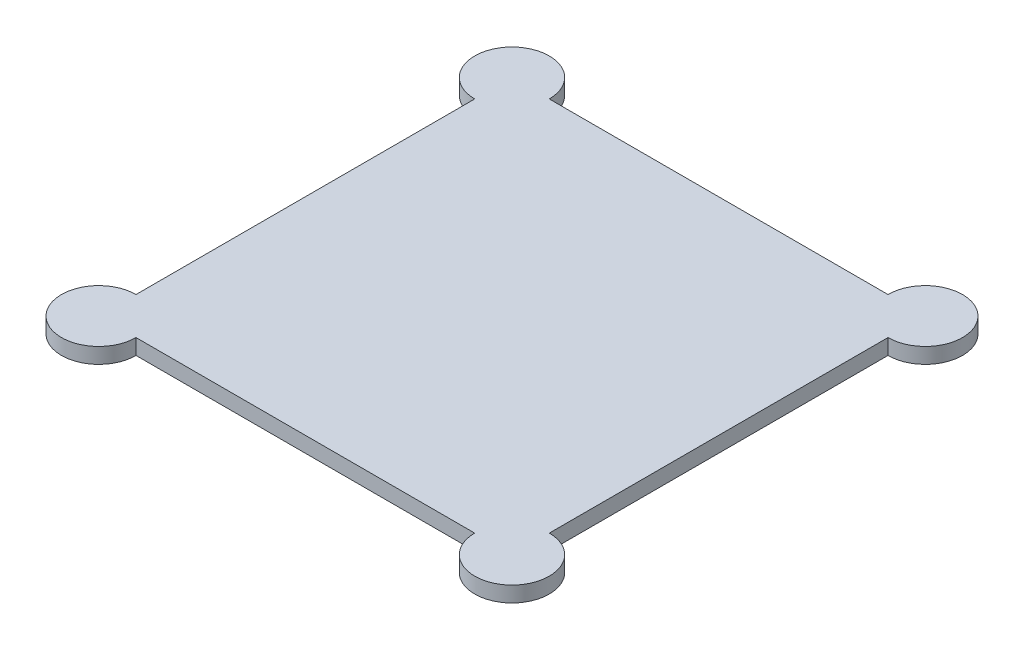
ISO-10303-21;
HEADER;
FILE_DESCRIPTION(('STEP AP214'),'2;1');
FILE_NAME('part.step','',(''),(''),'','','');
FILE_SCHEMA(('AUTOMOTIVE_DESIGN { 1 0 10303 214 1 1 1 1 }'));
ENDSEC;
DATA;
#1=APPLICATION_CONTEXT('core data for automotive mechanical design processes');
#2=APPLICATION_PROTOCOL_DEFINITION('international standard','automotive_design',2000,#1);
#3=PRODUCT_CONTEXT('',#1,'mechanical');
#4=PRODUCT('Part','Part','',(#3));
#5=PRODUCT_RELATED_PRODUCT_CATEGORY('part','',(#4));
#6=PRODUCT_DEFINITION_FORMATION('','',#4);
#7=PRODUCT_DEFINITION_CONTEXT('part definition',#1,'design');
#8=PRODUCT_DEFINITION('design','',#6,#7);
#9=PRODUCT_DEFINITION_SHAPE('','',#8);
#10=(LENGTH_UNIT() NAMED_UNIT(*) SI_UNIT(.MILLI.,.METRE.));
#11=(NAMED_UNIT(*) PLANE_ANGLE_UNIT() SI_UNIT($,.RADIAN.));
#12=(NAMED_UNIT(*) SI_UNIT($,.STERADIAN.) SOLID_ANGLE_UNIT());
#13=UNCERTAINTY_MEASURE_WITH_UNIT(LENGTH_MEASURE(1.E-05),#10,'distance_accuracy_value','');
#14=(GEOMETRIC_REPRESENTATION_CONTEXT(3) GLOBAL_UNCERTAINTY_ASSIGNED_CONTEXT((#13)) GLOBAL_UNIT_ASSIGNED_CONTEXT((#10,
#11,#12)) REPRESENTATION_CONTEXT('',''));
#15=CARTESIAN_POINT('',(0.,0.,0.));
#16=DIRECTION('',(0.,0.,1.));
#17=DIRECTION('',(1.,0.,0.));
#18=AXIS2_PLACEMENT_3D('',#15,#16,#17);
#19=CARTESIAN_POINT('',(-133.,10.,133.));
#20=DIRECTION('',(0.,-1.,0.));
#21=DIRECTION('',(0.,0.,-1.));
#22=AXIS2_PLACEMENT_3D('',#19,#20,#21);
#23=CYLINDRICAL_SURFACE('',#22,24.);
#24=CARTESIAN_POINT('',(-133.,0.,133.));
#25=DIRECTION('',(0.,1.,0.));
#26=DIRECTION('',(0.,0.,1.));
#27=AXIS2_PLACEMENT_3D('',#24,#25,#26);
#28=CIRCLE('',#27,24.);
#29=CARTESIAN_POINT('',(-133.,0.,109.));
#30=VERTEX_POINT('',#29);
#31=CARTESIAN_POINT('',(-109.,0.,133.));
#32=VERTEX_POINT('',#31);
#33=EDGE_CURVE('E135',#30,#32,#28,.T.);
#34=ORIENTED_EDGE('',*,*,#33,.T.);
#35=DIRECTION('',(0.,-1.,0.));
#36=VECTOR('',#35,1.);
#37=CARTESIAN_POINT('',(-109.,10.,133.));
#38=LINE('',#37,#36);
#39=CARTESIAN_POINT('',(-109.,10.,133.));
#40=VERTEX_POINT('',#39);
#41=EDGE_CURVE('E11',#40,#32,#38,.T.);
#42=ORIENTED_EDGE('',*,*,#41,.F.);
#43=CARTESIAN_POINT('',(-133.,10.,133.));
#44=DIRECTION('',(0.,1.,0.));
#45=DIRECTION('',(0.,0.,1.));
#46=AXIS2_PLACEMENT_3D('',#43,#44,#45);
#47=CIRCLE('',#46,24.);
#48=CARTESIAN_POINT('',(-133.,10.,109.));
#49=VERTEX_POINT('',#48);
#50=EDGE_CURVE('E152',#49,#40,#47,.T.);
#51=ORIENTED_EDGE('',*,*,#50,.F.);
#52=DIRECTION('',(0.,-1.,0.));
#53=VECTOR('',#52,1.);
#54=CARTESIAN_POINT('',(-133.,10.,109.));
#55=LINE('',#54,#53);
#56=EDGE_CURVE('E134',#49,#30,#55,.T.);
#57=ORIENTED_EDGE('',*,*,#56,.T.);
#58=EDGE_LOOP('',(#34,#42,#51,#57));
#59=FACE_BOUND('',#58,.T.);
#60=ADVANCED_FACE('F37',(#59),#23,.T.);
#61=CARTESIAN_POINT('',(0.,10.,133.));
#62=DIRECTION('',(0.,0.,-1.));
#63=DIRECTION('',(-1.,0.,0.));
#64=AXIS2_PLACEMENT_3D('',#61,#62,#63);
#65=PLANE('',#64);
#66=DIRECTION('',(1.,0.,0.));
#67=VECTOR('',#66,1.);
#68=CARTESIAN_POINT('',(0.,0.,133.));
#69=LINE('',#68,#67);
#70=CARTESIAN_POINT('',(109.,0.,133.));
#71=VERTEX_POINT('',#70);
#72=EDGE_CURVE('E138',#32,#71,#69,.T.);
#73=ORIENTED_EDGE('',*,*,#72,.T.);
#74=DIRECTION('',(0.,-1.,0.));
#75=VECTOR('',#74,1.);
#76=CARTESIAN_POINT('',(109.,10.,133.));
#77=LINE('',#76,#75);
#78=CARTESIAN_POINT('',(109.,10.,133.));
#79=VERTEX_POINT('',#78);
#80=EDGE_CURVE('E45',#79,#71,#77,.T.);
#81=ORIENTED_EDGE('',*,*,#80,.F.);
#82=DIRECTION('',(1.,0.,0.));
#83=VECTOR('',#82,1.);
#84=CARTESIAN_POINT('',(0.,10.,133.));
#85=LINE('',#84,#83);
#86=EDGE_CURVE('E95',#40,#79,#85,.T.);
#87=ORIENTED_EDGE('',*,*,#86,.F.);
#88=ORIENTED_EDGE('',*,*,#41,.T.);
#89=EDGE_LOOP('',(#73,#81,#87,#88));
#90=FACE_BOUND('',#89,.T.);
#91=ADVANCED_FACE('F180',(#90),#65,.F.);
#92=CARTESIAN_POINT('',(133.,10.,133.));
#93=DIRECTION('',(0.,-1.,0.));
#94=DIRECTION('',(0.,0.,-1.));
#95=AXIS2_PLACEMENT_3D('',#92,#93,#94);
#96=CYLINDRICAL_SURFACE('',#95,24.);
#97=CARTESIAN_POINT('',(133.,0.,133.));
#98=DIRECTION('',(0.,1.,0.));
#99=DIRECTION('',(0.,0.,1.));
#100=AXIS2_PLACEMENT_3D('',#97,#98,#99);
#101=CIRCLE('',#100,24.);
#102=CARTESIAN_POINT('',(133.,0.,109.));
#103=VERTEX_POINT('',#102);
#104=EDGE_CURVE('E140',#71,#103,#101,.T.);
#105=ORIENTED_EDGE('',*,*,#104,.T.);
#106=DIRECTION('',(0.,-1.,0.));
#107=VECTOR('',#106,1.);
#108=CARTESIAN_POINT('',(133.,10.,109.));
#109=LINE('',#108,#107);
#110=CARTESIAN_POINT('',(133.,10.,109.));
#111=VERTEX_POINT('',#110);
#112=EDGE_CURVE('E158',#111,#103,#109,.T.);
#113=ORIENTED_EDGE('',*,*,#112,.F.);
#114=CARTESIAN_POINT('',(133.,10.,133.));
#115=DIRECTION('',(0.,1.,0.));
#116=DIRECTION('',(0.,0.,1.));
#117=AXIS2_PLACEMENT_3D('',#114,#115,#116);
#118=CIRCLE('',#117,24.);
#119=EDGE_CURVE('E165',#79,#111,#118,.T.);
#120=ORIENTED_EDGE('',*,*,#119,.F.);
#121=ORIENTED_EDGE('',*,*,#80,.T.);
#122=EDGE_LOOP('',(#105,#113,#120,#121));
#123=FACE_BOUND('',#122,.T.);
#124=ADVANCED_FACE('F163',(#123),#96,.T.);
#125=CARTESIAN_POINT('',(133.,10.,0.));
#126=DIRECTION('',(1.,0.,0.));
#127=DIRECTION('',(0.,0.,-1.));
#128=AXIS2_PLACEMENT_3D('',#125,#126,#127);
#129=PLANE('',#128);
#130=DIRECTION('',(0.,0.,1.));
#131=VECTOR('',#130,1.);
#132=CARTESIAN_POINT('',(133.,0.,0.));
#133=LINE('',#132,#131);
#134=CARTESIAN_POINT('',(133.,0.,-109.));
#135=VERTEX_POINT('',#134);
#136=EDGE_CURVE('E143',#135,#103,#133,.T.);
#137=ORIENTED_EDGE('',*,*,#136,.F.);
#138=DIRECTION('',(0.,-1.,0.));
#139=VECTOR('',#138,1.);
#140=CARTESIAN_POINT('',(133.,10.,-109.));
#141=LINE('',#140,#139);
#142=CARTESIAN_POINT('',(133.,10.,-109.));
#143=VERTEX_POINT('',#142);
#144=EDGE_CURVE('E156',#143,#135,#141,.T.);
#145=ORIENTED_EDGE('',*,*,#144,.F.);
#146=DIRECTION('',(0.,0.,1.));
#147=VECTOR('',#146,1.);
#148=CARTESIAN_POINT('',(133.,10.,0.));
#149=LINE('',#148,#147);
#150=EDGE_CURVE('E129',#143,#111,#149,.T.);
#151=ORIENTED_EDGE('',*,*,#150,.T.);
#152=ORIENTED_EDGE('',*,*,#112,.T.);
#153=EDGE_LOOP('',(#137,#145,#151,#152));
#154=FACE_BOUND('',#153,.T.);
#155=ADVANCED_FACE('F172',(#154),#129,.T.);
#156=CARTESIAN_POINT('',(133.,10.,-133.));
#157=DIRECTION('',(0.,-1.,0.));
#158=DIRECTION('',(0.,0.,-1.));
#159=AXIS2_PLACEMENT_3D('',#156,#157,#158);
#160=CYLINDRICAL_SURFACE('',#159,24.);
#161=CARTESIAN_POINT('',(133.,0.,-133.));
#162=DIRECTION('',(0.,1.,0.));
#163=DIRECTION('',(0.,0.,1.));
#164=AXIS2_PLACEMENT_3D('',#161,#162,#163);
#165=CIRCLE('',#164,24.);
#166=CARTESIAN_POINT('',(109.,0.,-133.));
#167=VERTEX_POINT('',#166);
#168=EDGE_CURVE('E146',#135,#167,#165,.T.);
#169=ORIENTED_EDGE('',*,*,#168,.T.);
#170=DIRECTION('',(0.,-1.,0.));
#171=VECTOR('',#170,1.);
#172=CARTESIAN_POINT('',(109.,10.,-133.));
#173=LINE('',#172,#171);
#174=CARTESIAN_POINT('',(109.,10.,-133.));
#175=VERTEX_POINT('',#174);
#176=EDGE_CURVE('E117',#175,#167,#173,.T.);
#177=ORIENTED_EDGE('',*,*,#176,.F.);
#178=CARTESIAN_POINT('',(133.,10.,-133.));
#179=DIRECTION('',(0.,1.,0.));
#180=DIRECTION('',(0.,0.,1.));
#181=AXIS2_PLACEMENT_3D('',#178,#179,#180);
#182=CIRCLE('',#181,24.);
#183=EDGE_CURVE('E126',#143,#175,#182,.T.);
#184=ORIENTED_EDGE('',*,*,#183,.F.);
#185=ORIENTED_EDGE('',*,*,#144,.T.);
#186=EDGE_LOOP('',(#169,#177,#184,#185));
#187=FACE_BOUND('',#186,.T.);
#188=ADVANCED_FACE('F190',(#187),#160,.T.);
#189=CARTESIAN_POINT('',(0.,10.,-133.));
#190=DIRECTION('',(0.,0.,-1.));
#191=DIRECTION('',(-1.,0.,0.));
#192=AXIS2_PLACEMENT_3D('',#189,#190,#191);
#193=PLANE('',#192);
#194=DIRECTION('',(1.,0.,0.));
#195=VECTOR('',#194,1.);
#196=CARTESIAN_POINT('',(0.,0.,-133.));
#197=LINE('',#196,#195);
#198=CARTESIAN_POINT('',(-109.,0.,-133.));
#199=VERTEX_POINT('',#198);
#200=EDGE_CURVE('E116',#199,#167,#197,.T.);
#201=ORIENTED_EDGE('',*,*,#200,.F.);
#202=DIRECTION('',(0.,-1.,0.));
#203=VECTOR('',#202,1.);
#204=CARTESIAN_POINT('',(-109.,10.,-133.));
#205=LINE('',#204,#203);
#206=CARTESIAN_POINT('',(-109.,10.,-133.));
#207=VERTEX_POINT('',#206);
#208=EDGE_CURVE('E110',#207,#199,#205,.T.);
#209=ORIENTED_EDGE('',*,*,#208,.F.);
#210=DIRECTION('',(1.,0.,0.));
#211=VECTOR('',#210,1.);
#212=CARTESIAN_POINT('',(0.,10.,-133.));
#213=LINE('',#212,#211);
#214=EDGE_CURVE('E114',#207,#175,#213,.T.);
#215=ORIENTED_EDGE('',*,*,#214,.T.);
#216=ORIENTED_EDGE('',*,*,#176,.T.);
#217=EDGE_LOOP('',(#201,#209,#215,#216));
#218=FACE_BOUND('',#217,.T.);
#219=ADVANCED_FACE('F112',(#218),#193,.T.);
#220=CARTESIAN_POINT('',(-133.,10.,-133.));
#221=DIRECTION('',(0.,-1.,0.));
#222=DIRECTION('',(0.,0.,-1.));
#223=AXIS2_PLACEMENT_3D('',#220,#221,#222);
#224=CYLINDRICAL_SURFACE('',#223,24.);
#225=CARTESIAN_POINT('',(-133.,0.,-133.));
#226=DIRECTION('',(0.,1.,0.));
#227=DIRECTION('',(0.,0.,1.));
#228=AXIS2_PLACEMENT_3D('',#225,#226,#227);
#229=CIRCLE('',#228,24.);
#230=CARTESIAN_POINT('',(-133.,0.,-109.));
#231=VERTEX_POINT('',#230);
#232=EDGE_CURVE('E81',#199,#231,#229,.T.);
#233=ORIENTED_EDGE('',*,*,#232,.T.);
#234=DIRECTION('',(0.,-1.,0.));
#235=VECTOR('',#234,1.);
#236=CARTESIAN_POINT('',(-133.,10.,-109.));
#237=LINE('',#236,#235);
#238=CARTESIAN_POINT('',(-133.,10.,-109.));
#239=VERTEX_POINT('',#238);
#240=EDGE_CURVE('E118',#239,#231,#237,.T.);
#241=ORIENTED_EDGE('',*,*,#240,.F.);
#242=CARTESIAN_POINT('',(-133.,10.,-133.));
#243=DIRECTION('',(0.,1.,0.));
#244=DIRECTION('',(0.,0.,1.));
#245=AXIS2_PLACEMENT_3D('',#242,#243,#244);
#246=CIRCLE('',#245,24.);
#247=EDGE_CURVE('E120',#207,#239,#246,.T.);
#248=ORIENTED_EDGE('',*,*,#247,.F.);
#249=ORIENTED_EDGE('',*,*,#208,.T.);
#250=EDGE_LOOP('',(#233,#241,#248,#249));
#251=FACE_BOUND('',#250,.T.);
#252=ADVANCED_FACE('F121',(#251),#224,.T.);
#253=CARTESIAN_POINT('',(-133.,10.,0.));
#254=DIRECTION('',(1.,0.,0.));
#255=DIRECTION('',(0.,0.,-1.));
#256=AXIS2_PLACEMENT_3D('',#253,#254,#255);
#257=PLANE('',#256);
#258=DIRECTION('',(0.,0.,1.));
#259=VECTOR('',#258,1.);
#260=CARTESIAN_POINT('',(-133.,0.,0.));
#261=LINE('',#260,#259);
#262=EDGE_CURVE('E87',#231,#30,#261,.T.);
#263=ORIENTED_EDGE('',*,*,#262,.T.);
#264=ORIENTED_EDGE('',*,*,#56,.F.);
#265=DIRECTION('',(0.,0.,1.));
#266=VECTOR('',#265,1.);
#267=CARTESIAN_POINT('',(-133.,10.,0.));
#268=LINE('',#267,#266);
#269=EDGE_CURVE('E53',#239,#49,#268,.T.);
#270=ORIENTED_EDGE('',*,*,#269,.F.);
#271=ORIENTED_EDGE('',*,*,#240,.T.);
#272=EDGE_LOOP('',(#263,#264,#270,#271));
#273=FACE_BOUND('',#272,.T.);
#274=ADVANCED_FACE('F198',(#273),#257,.F.);
#275=CARTESIAN_POINT('',(0.,10.,0.));
#276=DIRECTION('',(0.,1.,0.));
#277=DIRECTION('',(0.,0.,1.));
#278=AXIS2_PLACEMENT_3D('',#275,#276,#277);
#279=PLANE('',#278);
#280=ORIENTED_EDGE('',*,*,#50,.T.);
#281=ORIENTED_EDGE('',*,*,#86,.T.);
#282=ORIENTED_EDGE('',*,*,#119,.T.);
#283=ORIENTED_EDGE('',*,*,#150,.F.);
#284=ORIENTED_EDGE('',*,*,#183,.T.);
#285=ORIENTED_EDGE('',*,*,#214,.F.);
#286=ORIENTED_EDGE('',*,*,#247,.T.);
#287=ORIENTED_EDGE('',*,*,#269,.T.);
#288=EDGE_LOOP('',(#280,#281,#282,#283,#284,#285,#286,#287));
#289=FACE_BOUND('',#288,.T.);
#290=ADVANCED_FACE('F123',(#289),#279,.T.);
#291=CARTESIAN_POINT('',(0.,0.,0.));
#292=DIRECTION('',(0.,1.,0.));
#293=DIRECTION('',(0.,0.,1.));
#294=AXIS2_PLACEMENT_3D('',#291,#292,#293);
#295=PLANE('',#294);
#296=ORIENTED_EDGE('',*,*,#33,.F.);
#297=ORIENTED_EDGE('',*,*,#262,.F.);
#298=ORIENTED_EDGE('',*,*,#232,.F.);
#299=ORIENTED_EDGE('',*,*,#200,.T.);
#300=ORIENTED_EDGE('',*,*,#168,.F.);
#301=ORIENTED_EDGE('',*,*,#136,.T.);
#302=ORIENTED_EDGE('',*,*,#104,.F.);
#303=ORIENTED_EDGE('',*,*,#72,.F.);
#304=EDGE_LOOP('',(#296,#297,#298,#299,#300,#301,#302,#303));
#305=FACE_BOUND('',#304,.T.);
#306=ADVANCED_FACE('F168',(#305),#295,.F.);
#307=CLOSED_SHELL('',(#60,#91,#124,#155,#188,#219,#252,#274,#290,#306));
#308=MANIFOLD_SOLID_BREP('B2',#307);
#309=ADVANCED_BREP_SHAPE_REPRESENTATION('',(#18,#308),#14);
#310=SHAPE_DEFINITION_REPRESENTATION(#9,#309);
ENDSEC;
END-ISO-10303-21;
